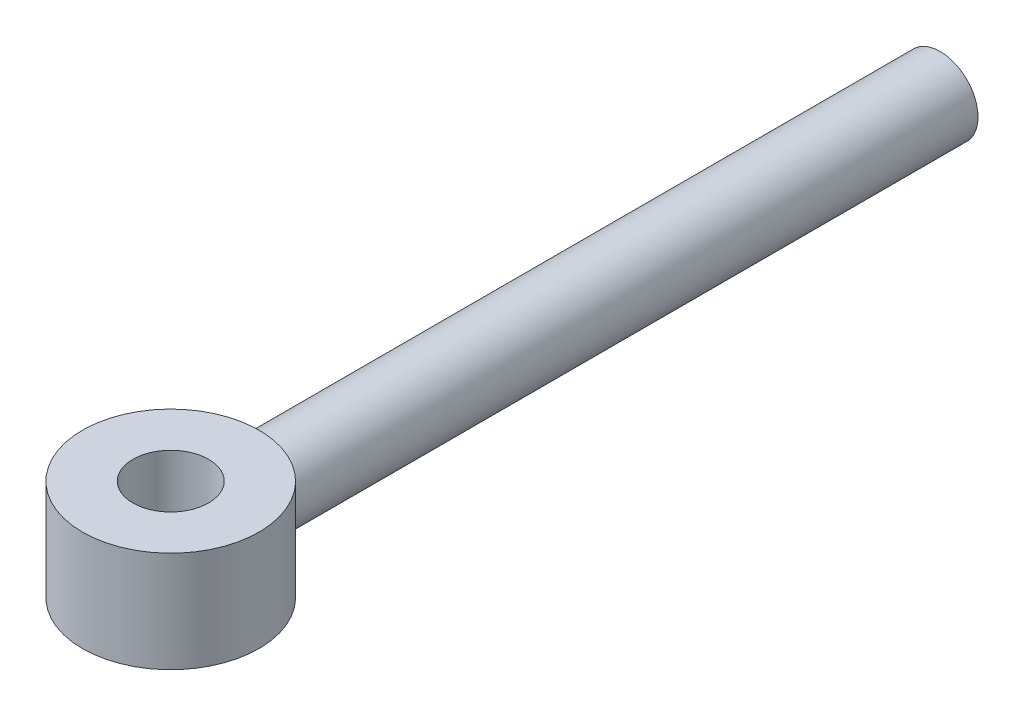
ISO-10303-21;
HEADER;
FILE_DESCRIPTION(('STEP AP214'),'2;1');
FILE_NAME('part.step','',(''),(''),'','','');
FILE_SCHEMA(('AUTOMOTIVE_DESIGN { 1 0 10303 214 1 1 1 1 }'));
ENDSEC;
DATA;
#1=APPLICATION_CONTEXT('core data for automotive mechanical design processes');
#2=APPLICATION_PROTOCOL_DEFINITION('international standard','automotive_design',2000,#1);
#3=PRODUCT_CONTEXT('',#1,'mechanical');
#4=PRODUCT('Part','Part','',(#3));
#5=PRODUCT_RELATED_PRODUCT_CATEGORY('part','',(#4));
#6=PRODUCT_DEFINITION_FORMATION('','',#4);
#7=PRODUCT_DEFINITION_CONTEXT('part definition',#1,'design');
#8=PRODUCT_DEFINITION('design','',#6,#7);
#9=PRODUCT_DEFINITION_SHAPE('','',#8);
#10=(LENGTH_UNIT() NAMED_UNIT(*) SI_UNIT(.MILLI.,.METRE.));
#11=(NAMED_UNIT(*) PLANE_ANGLE_UNIT() SI_UNIT($,.RADIAN.));
#12=(NAMED_UNIT(*) SI_UNIT($,.STERADIAN.) SOLID_ANGLE_UNIT());
#13=UNCERTAINTY_MEASURE_WITH_UNIT(LENGTH_MEASURE(1.E-05),#10,'distance_accuracy_value','');
#14=(GEOMETRIC_REPRESENTATION_CONTEXT(3) GLOBAL_UNCERTAINTY_ASSIGNED_CONTEXT((#13)) GLOBAL_UNIT_ASSIGNED_CONTEXT((#10,
#11,#12)) REPRESENTATION_CONTEXT('',''));
#15=CARTESIAN_POINT('',(0.,0.,0.));
#16=DIRECTION('',(0.,0.,1.));
#17=DIRECTION('',(1.,0.,0.));
#18=AXIS2_PLACEMENT_3D('',#15,#16,#17);
#19=CARTESIAN_POINT('',(0.,-4.,61.));
#20=DIRECTION('',(0.,1.,0.));
#21=DIRECTION('',(0.,0.,1.));
#22=AXIS2_PLACEMENT_3D('',#19,#20,#21);
#23=CYLINDRICAL_SURFACE('',#22,7.);
#24=CARTESIAN_POINT('',(0.,-4.,61.));
#25=DIRECTION('',(0.,1.,0.));
#26=DIRECTION('',(0.,0.,1.));
#27=AXIS2_PLACEMENT_3D('',#24,#25,#26);
#28=CIRCLE('',#27,7.);
#29=CARTESIAN_POINT('',(0.,-4.,68.));
#30=VERTEX_POINT('',#29);
#31=EDGE_CURVE('E49',#30,#30,#28,.T.);
#32=ORIENTED_EDGE('',*,*,#31,.T.);
#33=EDGE_LOOP('',(#32));
#34=FACE_BOUND('',#33,.T.);
#35=CARTESIAN_POINT('',(0.,4.,61.));
#36=DIRECTION('',(0.,1.,0.));
#37=DIRECTION('',(0.,0.,1.));
#38=AXIS2_PLACEMENT_3D('',#35,#36,#37);
#39=CIRCLE('',#38,7.);
#40=CARTESIAN_POINT('',(0.,4.,68.));
#41=VERTEX_POINT('',#40);
#42=EDGE_CURVE('E53',#41,#41,#39,.T.);
#43=ORIENTED_EDGE('',*,*,#42,.F.);
#44=EDGE_LOOP('',(#43));
#45=FACE_BOUND('',#44,.T.);
#46=CARTESIAN_POINT('',(-3.,0.,54.6754446796632));
#47=CARTESIAN_POINT('',(-2.99999904512121,0.0798007630308856,54.6754437608207));
#48=CARTESIAN_POINT('',(-2.99680914186365,0.159630819970554,54.6739274041062));
#49=CARTESIAN_POINT('',(-2.98409481890062,0.318686890954848,54.6679215538918));
#50=CARTESIAN_POINT('',(-2.97456636476115,0.39791248776008,54.663430166818));
#51=CARTESIAN_POINT('',(-2.93654933365817,0.634089026543292,54.6456686167969));
#52=CARTESIAN_POINT('',(-2.8986294210123,0.789319965857246,54.6281116520019));
#53=CARTESIAN_POINT('',(-2.79949691759116,1.08987031559865,54.5839504078883));
#54=CARTESIAN_POINT('',(-2.73838302089272,1.2352286875862,54.5573845132925));
#55=CARTESIAN_POINT('',(-2.59488993442856,1.51362554399775,54.4982653822389));
#56=CARTESIAN_POINT('',(-2.51251491871712,1.6466664396721,54.4657133213656));
#57=CARTESIAN_POINT('',(-2.32303426891366,1.90545283950425,54.395888916779));
#58=CARTESIAN_POINT('',(-2.21474428773221,2.03028626905129,54.3584507058194));
#59=CARTESIAN_POINT('',(-1.9789916252315,2.26070185705907,54.2844321244387));
#60=CARTESIAN_POINT('',(-1.85152133453084,2.36627633799759,54.2478521011733));
#61=CARTESIAN_POINT('',(-1.5737748906695,2.55991924045861,54.17763557584));
#62=CARTESIAN_POINT('',(-1.42271545416052,2.64694925207732,54.1442141371615));
#63=CARTESIAN_POINT('',(-1.10640716164425,2.79396416664462,54.0861257779493));
#64=CARTESIAN_POINT('',(-0.941164994307304,2.85396173574506,54.0614547585294));
#65=CARTESIAN_POINT('',(-0.610764262051988,2.94186503636095,54.0248252893771));
#66=CARTESIAN_POINT('',(-0.446095117735236,2.9713460690391,54.0122455170057));
#67=CARTESIAN_POINT('',(-0.113699399968669,3.00248269671715,53.9989507408559));
#68=CARTESIAN_POINT('',(0.0540258257506366,3.004150273699,53.9982306279614));
#69=CARTESIAN_POINT('',(0.376268415183326,2.98040975220894,54.0083796677116));
#70=CARTESIAN_POINT('',(0.530941438169345,2.9567362003163,54.0185064044833));
#71=CARTESIAN_POINT('',(0.833871717827573,2.88597593107983,54.0481779437112));
#72=CARTESIAN_POINT('',(0.982128499493935,2.83888748350142,54.06772344216));
#73=CARTESIAN_POINT('',(1.27075797068383,2.72209341034733,54.1147330667079));
#74=CARTESIAN_POINT('',(1.41097529460903,2.65205270767087,54.1423137921824));
#75=CARTESIAN_POINT('',(1.67803533028446,2.4916826446237,54.2027232499576));
#76=CARTESIAN_POINT('',(1.8048732130277,2.40134599545929,54.2355538664045));
#77=CARTESIAN_POINT('',(2.05154784007322,2.19519049332399,54.3060620969875));
#78=CARTESIAN_POINT('',(2.1701729768624,2.07798113022601,54.3439186089254));
#79=CARTESIAN_POINT('',(2.38662617777592,1.82529716835046,54.4184236865739));
#80=CARTESIAN_POINT('',(2.48444526456873,1.68981472619326,54.4550717251167));
#81=CARTESIAN_POINT('',(2.65987942757701,1.39822012552853,54.5243316456883));
#82=CARTESIAN_POINT('',(2.73662769389096,1.24153585451875,54.5567476182695));
#83=CARTESIAN_POINT('',(2.86214771894642,0.915710991656657,54.6115060552112));
#84=CARTESIAN_POINT('',(2.9109408263676,0.746580016741966,54.6338562038003));
#85=CARTESIAN_POINT('',(2.9759867011968,0.412827204387951,54.6640144950136));
#86=CARTESIAN_POINT('',(2.99421280080632,0.248671019392695,54.6727020228717));
#87=CARTESIAN_POINT('',(3.00343131976712,-0.0805489751082779,54.6770701139339));
#88=CARTESIAN_POINT('',(2.99443410914468,-0.245612415107461,54.6727556299257));
#89=CARTESIAN_POINT('',(2.9512647841786,-0.55986257374344,54.6525185684182));
#90=CARTESIAN_POINT('',(2.9188846108295,-0.709355740371772,54.6374230512892));
#91=CARTESIAN_POINT('',(2.83228012727602,-1.00064547636968,54.5984042699926));
#92=CARTESIAN_POINT('',(2.77805051059372,-1.14244016654448,54.5744788614669));
#93=CARTESIAN_POINT('',(2.64668378105435,-1.42120989029112,54.5192333275142));
#94=CARTESIAN_POINT('',(2.5686531941561,-1.55770732182204,54.4876369175262));
#95=CARTESIAN_POINT('',(2.39277124314047,-1.81635070551129,54.4209816601599));
#96=CARTESIAN_POINT('',(2.29491096228641,-1.93849016219807,54.3859212587902));
#97=CARTESIAN_POINT('',(2.07211495440809,-2.1760289255727,54.3126060343416));
#98=CARTESIAN_POINT('',(1.94556360485739,-2.28991523722376,54.2743388898494));
#99=CARTESIAN_POINT('',(1.67428466903032,-2.4951342372748,54.2017305250248));
#100=CARTESIAN_POINT('',(1.5295552644811,-2.58646466679208,54.1673896980824));
#101=CARTESIAN_POINT('',(1.2245807874168,-2.74408268980707,54.1061856082753));
#102=CARTESIAN_POINT('',(1.06426298143306,-2.8102450462872,54.0793599107042));
#103=CARTESIAN_POINT('',(0.733319762769441,-2.91414979815623,54.036523395154));
#104=CARTESIAN_POINT('',(0.562700954301777,-2.95191019800838,54.0205057264532));
#105=CARTESIAN_POINT('',(0.229480384595673,-2.99557746015662,54.0019191871358));
#106=CARTESIAN_POINT('',(0.0672060876467171,-3.00361382051941,53.9984516284179));
#107=CARTESIAN_POINT('',(-0.256339620951761,-2.99340448125966,54.0028259829527));
#108=CARTESIAN_POINT('',(-0.417611220908518,-2.97516387599597,54.0106657040447));
#109=CARTESIAN_POINT('',(-0.728044798339692,-2.91444649582745,54.0362877574197));
#110=CARTESIAN_POINT('',(-0.877433690400417,-2.87294615263452,54.0536689734187));
#111=CARTESIAN_POINT('',(-1.16704890744754,-2.76798381608021,54.0964179974034));
#112=CARTESIAN_POINT('',(-1.30727354037359,-2.70451778058432,54.1217872752775));
#113=CARTESIAN_POINT('',(-1.58164154030708,-2.55421011216401,54.1795189985542));
#114=CARTESIAN_POINT('',(-1.71521554911027,-2.46643407814649,54.2121476982875));
#115=CARTESIAN_POINT('',(-1.96631980223031,-2.2713182864619,54.2805839812389));
#116=CARTESIAN_POINT('',(-2.08384366642575,-2.16397078827051,54.316392819319));
#117=CARTESIAN_POINT('',(-2.30839582375668,-1.92361613655686,54.3904397017347));
#118=CARTESIAN_POINT('',(-2.41404185093547,-1.78931158538105,54.4286652814512));
#119=CARTESIAN_POINT('',(-2.60157161791913,-1.5036538672722,54.5006185337514));
#120=CARTESIAN_POINT('',(-2.68344152863089,-1.35229084924018,54.5343435825168));
#121=CARTESIAN_POINT('',(-2.78618250414778,-1.11561755892373,54.5782741219582));
#122=CARTESIAN_POINT('',(-2.81707998873811,-1.03514424084098,54.5918054280858));
#123=CARTESIAN_POINT('',(-2.87192428390112,-0.871483777167922,54.6161958858199));
#124=CARTESIAN_POINT('',(-2.89587453038153,-0.788297995808767,54.6270563579395));
#125=CARTESIAN_POINT('',(-2.93649221837599,-0.620069192318679,54.6456698527048));
#126=CARTESIAN_POINT('',(-2.9531788427136,-0.535031692618033,54.6534310558083));
#127=CARTESIAN_POINT('',(-2.97913893233313,-0.363637228287148,54.6655750629324));
#128=CARTESIAN_POINT('',(-2.9884180785096,-0.277281326658793,54.6699604558149));
#129=CARTESIAN_POINT('',(-2.99595579124565,-0.158938599823643,54.6735277048744));
#130=CARTESIAN_POINT('',(-2.99747183035651,-0.127175719240051,54.6742459802529));
#131=CARTESIAN_POINT('',(-2.99949413311609,-0.0636101108314408,54.6752046545907));
#132=CARTESIAN_POINT('',(-3.00000038060031,-0.0318073823767013,54.6754450459));
#133=CARTESIAN_POINT('',(-3.,0.,54.6754446796632));
#134=B_SPLINE_CURVE_WITH_KNOTS('',3,(#46,#47,#48,#49,#50,#51,#52,#53,#54,#55,#56,#57,#58,#59,
#60,#61,#62,#63,#64,#65,#66,#67,#68,#69,#70,#71,#72,#73,#74,#75,#76,#77,#78,#79,#80,#81,#82,#83,
#84,#85,#86,#87,#88,#89,#90,#91,#92,#93,#94,#95,#96,#97,#98,#99,#100,#101,#102,#103,#104,#105,
#106,#107,#108,#109,#110,#111,#112,#113,#114,#115,#116,#117,#118,#119,#120,#121,#122,#123,#124,
#125,#126,#127,#128,#129,#130,#131,#132,#133),.UNSPECIFIED.,.T.,.F.,(4,2,2,2,2,2,2,2,2,2,2,2,2,
2,2,2,2,2,2,2,2,2,2,2,2,2,2,2,2,2,2,2,2,2,2,2,2,2,2,2,2,2,2,4),(0.,0.239366653231037,
0.478885807272612,0.958574399125932,1.43624431857918,1.91382053150697,2.41995684393642,
2.92629448725105,3.45610451675016,3.98566604296333,4.48627308722847,4.98666446539179,
5.45487182502104,5.92311378779297,6.39852111765621,6.8740994521391,7.38485137094338,
7.89582322238326,8.42542768080316,8.95462715213609,9.44812252419892,9.94142993544506,
10.4004743903489,10.8596303986217,11.3387499488479,11.8180854227975,12.3391595177845,
12.8602857751477,13.3839722669446,13.9073265049035,14.3923682623503,14.8773159966024,
15.3432850585276,15.8093399138768,16.2966585998759,16.784170440423,17.3070906286303,
17.8303143607246,18.0917878499581,18.3531318004373,18.6137813055803,18.8742307225593,
18.9696371385413,19.0650450817536),.UNSPECIFIED.);
#135=CARTESIAN_POINT('',(-3.,0.,54.6754446796632));
#136=VERTEX_POINT('',#135);
#137=EDGE_CURVE('E38',#136,#136,#134,.T.);
#138=ORIENTED_EDGE('',*,*,#137,.F.);
#139=EDGE_LOOP('',(#138));
#140=FACE_BOUND('',#139,.T.);
#141=ADVANCED_FACE('F33',(#34,#45,#140),#23,.T.);
#142=CARTESIAN_POINT('',(0.,-4.,61.));
#143=DIRECTION('',(0.,1.,0.));
#144=DIRECTION('',(0.,0.,1.));
#145=AXIS2_PLACEMENT_3D('',#142,#143,#144);
#146=PLANE('',#145);
#147=CARTESIAN_POINT('',(0.,-4.,61.));
#148=DIRECTION('',(0.,1.,0.));
#149=DIRECTION('',(0.,0.,1.));
#150=AXIS2_PLACEMENT_3D('',#147,#148,#149);
#151=CIRCLE('',#150,3.);
#152=CARTESIAN_POINT('',(0.,-4.,64.));
#153=VERTEX_POINT('',#152);
#154=EDGE_CURVE('E56',#153,#153,#151,.T.);
#155=ORIENTED_EDGE('',*,*,#154,.T.);
#156=EDGE_LOOP('',(#155));
#157=FACE_BOUND('',#156,.T.);
#158=ORIENTED_EDGE('',*,*,#31,.F.);
#159=EDGE_LOOP('',(#158));
#160=FACE_BOUND('',#159,.T.);
#161=ADVANCED_FACE('F63',(#157,#160),#146,.F.);
#162=CARTESIAN_POINT('',(0.,4.,61.));
#163=DIRECTION('',(0.,1.,0.));
#164=DIRECTION('',(0.,0.,1.));
#165=AXIS2_PLACEMENT_3D('',#162,#163,#164);
#166=PLANE('',#165);
#167=CARTESIAN_POINT('',(0.,4.,61.));
#168=DIRECTION('',(0.,1.,0.));
#169=DIRECTION('',(0.,0.,1.));
#170=AXIS2_PLACEMENT_3D('',#167,#168,#169);
#171=CIRCLE('',#170,3.);
#172=CARTESIAN_POINT('',(0.,4.,64.));
#173=VERTEX_POINT('',#172);
#174=EDGE_CURVE('E57',#173,#173,#171,.T.);
#175=ORIENTED_EDGE('',*,*,#174,.F.);
#176=EDGE_LOOP('',(#175));
#177=FACE_BOUND('',#176,.T.);
#178=ORIENTED_EDGE('',*,*,#42,.T.);
#179=EDGE_LOOP('',(#178));
#180=FACE_BOUND('',#179,.T.);
#181=ADVANCED_FACE('F73',(#177,#180),#166,.T.);
#182=CARTESIAN_POINT('',(0.,0.,55.));
#183=DIRECTION('',(0.,0.,-1.));
#184=DIRECTION('',(-1.,0.,0.));
#185=AXIS2_PLACEMENT_3D('',#182,#183,#184);
#186=CYLINDRICAL_SURFACE('',#185,3.);
#187=ORIENTED_EDGE('',*,*,#137,.T.);
#188=EDGE_LOOP('',(#187));
#189=FACE_BOUND('',#188,.T.);
#190=CARTESIAN_POINT('',(0.,0.,0.));
#191=DIRECTION('',(0.,0.,1.));
#192=DIRECTION('',(1.,0.,0.));
#193=AXIS2_PLACEMENT_3D('',#190,#191,#192);
#194=CIRCLE('',#193,3.);
#195=CARTESIAN_POINT('',(3.,0.,0.));
#196=VERTEX_POINT('',#195);
#197=EDGE_CURVE('E10',#196,#196,#194,.T.);
#198=ORIENTED_EDGE('',*,*,#197,.T.);
#199=EDGE_LOOP('',(#198));
#200=FACE_BOUND('',#199,.T.);
#201=ADVANCED_FACE('F35',(#189,#200),#186,.T.);
#202=CARTESIAN_POINT('',(0.,0.,0.));
#203=DIRECTION('',(0.,0.,1.));
#204=DIRECTION('',(1.,0.,0.));
#205=AXIS2_PLACEMENT_3D('',#202,#203,#204);
#206=PLANE('',#205);
#207=ORIENTED_EDGE('',*,*,#197,.F.);
#208=EDGE_LOOP('',(#207));
#209=FACE_BOUND('',#208,.T.);
#210=ADVANCED_FACE('F69',(#209),#206,.F.);
#211=CARTESIAN_POINT('',(0.,-4.,61.));
#212=DIRECTION('',(0.,1.,0.));
#213=DIRECTION('',(0.,0.,1.));
#214=AXIS2_PLACEMENT_3D('',#211,#212,#213);
#215=CYLINDRICAL_SURFACE('',#214,3.);
#216=ORIENTED_EDGE('',*,*,#154,.F.);
#217=EDGE_LOOP('',(#216));
#218=FACE_BOUND('',#217,.T.);
#219=ORIENTED_EDGE('',*,*,#174,.T.);
#220=EDGE_LOOP('',(#219));
#221=FACE_BOUND('',#220,.T.);
#222=ADVANCED_FACE('F66',(#218,#221),#215,.F.);
#223=CLOSED_SHELL('',(#141,#161,#181,#201,#210,#222));
#224=MANIFOLD_SOLID_BREP('B2',#223);
#225=ADVANCED_BREP_SHAPE_REPRESENTATION('',(#18,#224),#14);
#226=SHAPE_DEFINITION_REPRESENTATION(#9,#225);
ENDSEC;
END-ISO-10303-21;
